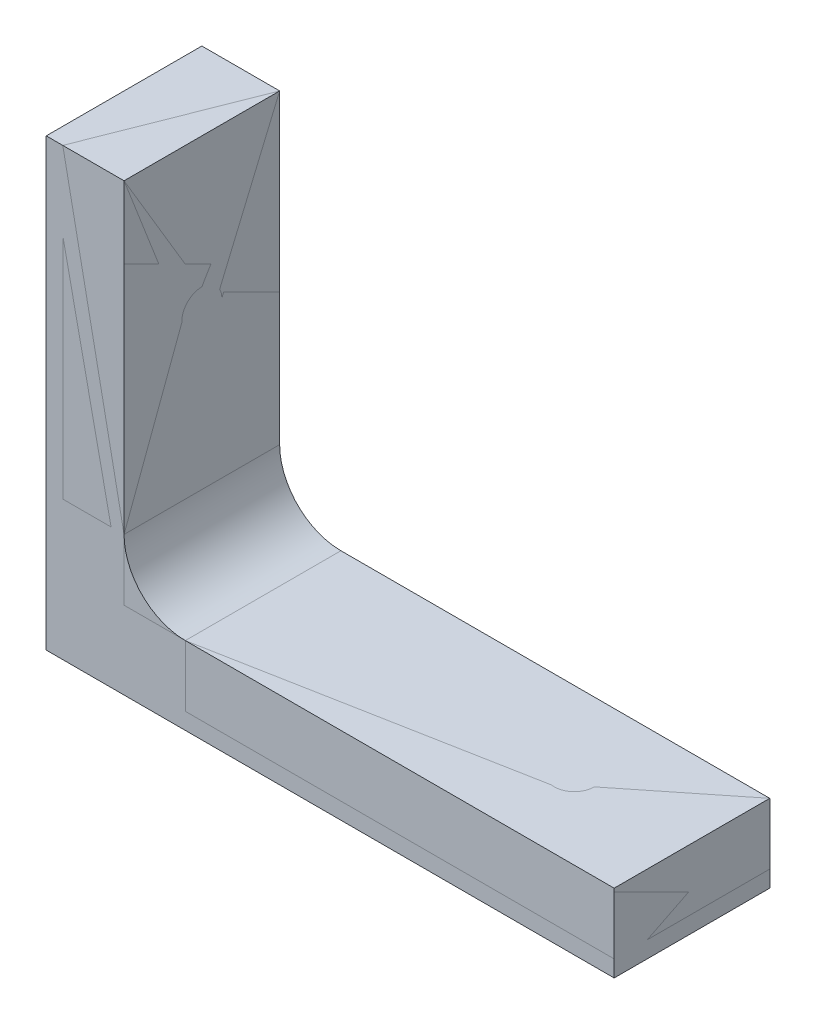
ISO-10303-21;
HEADER;
FILE_DESCRIPTION(('STEP AP214'),'2;1');
FILE_NAME('part.step','',(''),(''),'','','');
FILE_SCHEMA(('AUTOMOTIVE_DESIGN { 1 0 10303 214 1 1 1 1 }'));
ENDSEC;
DATA;
#1=APPLICATION_CONTEXT('core data for automotive mechanical design processes');
#2=APPLICATION_PROTOCOL_DEFINITION('international standard','automotive_design',2000,#1);
#3=PRODUCT_CONTEXT('',#1,'mechanical');
#4=PRODUCT('Part','Part','',(#3));
#5=PRODUCT_RELATED_PRODUCT_CATEGORY('part','',(#4));
#6=PRODUCT_DEFINITION_FORMATION('','',#4);
#7=PRODUCT_DEFINITION_CONTEXT('part definition',#1,'design');
#8=PRODUCT_DEFINITION('design','',#6,#7);
#9=PRODUCT_DEFINITION_SHAPE('','',#8);
#10=(LENGTH_UNIT() NAMED_UNIT(*) SI_UNIT(.MILLI.,.METRE.));
#11=(NAMED_UNIT(*) PLANE_ANGLE_UNIT() SI_UNIT($,.RADIAN.));
#12=(NAMED_UNIT(*) SI_UNIT($,.STERADIAN.) SOLID_ANGLE_UNIT());
#13=UNCERTAINTY_MEASURE_WITH_UNIT(LENGTH_MEASURE(1.E-05),#10,'distance_accuracy_value','');
#14=(GEOMETRIC_REPRESENTATION_CONTEXT(3) GLOBAL_UNCERTAINTY_ASSIGNED_CONTEXT((#13)) GLOBAL_UNIT_ASSIGNED_CONTEXT((#10,
#11,#12)) REPRESENTATION_CONTEXT('',''));
#15=CARTESIAN_POINT('',(0.,0.,0.));
#16=DIRECTION('',(0.,0.,1.));
#17=DIRECTION('',(1.,0.,0.));
#18=AXIS2_PLACEMENT_3D('',#15,#16,#17);
#19=CARTESIAN_POINT('',(6.35,0.,0.));
#20=DIRECTION('',(0.,0.,1.));
#21=DIRECTION('',(0.,-1.,0.));
#22=AXIS2_PLACEMENT_3D('',#19,#20,#21);
#23=PLANE('',#22);
#24=DIRECTION('',(1.,0.,0.));
#25=VECTOR('',#24,1.);
#26=CARTESIAN_POINT('',(6.35,-25.,0.));
#27=LINE('',#26,#25);
#28=CARTESIAN_POINT('',(1.35,-25.,0.));
#29=VERTEX_POINT('',#28);
#30=CARTESIAN_POINT('',(6.35,-25.,0.));
#31=VERTEX_POINT('',#30);
#32=EDGE_CURVE('E12',#29,#31,#27,.T.);
#33=ORIENTED_EDGE('',*,*,#32,.F.);
#34=DIRECTION('',(0.,1.,0.));
#35=VECTOR('',#34,1.);
#36=CARTESIAN_POINT('',(1.35,0.,0.));
#37=LINE('',#36,#35);
#38=CARTESIAN_POINT('',(1.35,0.,0.));
#39=VERTEX_POINT('',#38);
#40=EDGE_CURVE('E106',#39,#29,#37,.F.);
#41=ORIENTED_EDGE('',*,*,#40,.F.);
#42=DIRECTION('',(1.,0.,0.));
#43=VECTOR('',#42,1.);
#44=CARTESIAN_POINT('',(6.35,0.,0.));
#45=LINE('',#44,#43);
#46=CARTESIAN_POINT('',(6.35,0.,0.));
#47=VERTEX_POINT('',#46);
#48=EDGE_CURVE('E65',#39,#47,#45,.T.);
#49=ORIENTED_EDGE('',*,*,#48,.T.);
#50=DIRECTION('',(0.,-1.,0.));
#51=VECTOR('',#50,1.);
#52=CARTESIAN_POINT('',(6.35,0.,0.));
#53=LINE('',#52,#51);
#54=EDGE_CURVE('E109',#47,#31,#53,.T.);
#55=ORIENTED_EDGE('',*,*,#54,.T.);
#56=EDGE_LOOP('',(#33,#41,#49,#55));
#57=FACE_BOUND('',#56,.T.);
#58=ADVANCED_FACE('F55',(#57),#23,.F.);
#59=CARTESIAN_POINT('',(6.35,0.,12.7));
#60=DIRECTION('',(0.,-1.,0.));
#61=DIRECTION('',(0.,0.,-1.));
#62=AXIS2_PLACEMENT_3D('',#59,#60,#61);
#63=PLANE('',#62);
#64=ORIENTED_EDGE('',*,*,#48,.F.);
#65=DIRECTION('',(0.,0.,1.));
#66=VECTOR('',#65,1.);
#67=CARTESIAN_POINT('',(1.35,0.,12.7));
#68=LINE('',#67,#66);
#69=CARTESIAN_POINT('',(1.35,0.,12.7));
#70=VERTEX_POINT('',#69);
#71=EDGE_CURVE('E134',#70,#39,#68,.F.);
#72=ORIENTED_EDGE('',*,*,#71,.F.);
#73=DIRECTION('',(1.,0.,0.));
#74=VECTOR('',#73,1.);
#75=CARTESIAN_POINT('',(6.35,0.,12.7));
#76=LINE('',#75,#74);
#77=CARTESIAN_POINT('',(6.35,0.,12.7));
#78=VERTEX_POINT('',#77);
#79=EDGE_CURVE('E156',#70,#78,#76,.T.);
#80=ORIENTED_EDGE('',*,*,#79,.T.);
#81=DIRECTION('',(0.,0.,-1.));
#82=VECTOR('',#81,1.);
#83=CARTESIAN_POINT('',(6.35,0.,12.7));
#84=LINE('',#83,#82);
#85=EDGE_CURVE('E196',#78,#47,#84,.T.);
#86=ORIENTED_EDGE('',*,*,#85,.T.);
#87=EDGE_LOOP('',(#64,#72,#80,#86));
#88=FACE_BOUND('',#87,.T.);
#89=ADVANCED_FACE('F192',(#88),#63,.F.);
#90=CARTESIAN_POINT('',(6.35,0.,12.7));
#91=DIRECTION('',(0.,0.,1.));
#92=DIRECTION('',(0.,-1.,0.));
#93=AXIS2_PLACEMENT_3D('',#90,#91,#92);
#94=PLANE('',#93);
#95=ORIENTED_EDGE('',*,*,#79,.F.);
#96=DIRECTION('',(0.,1.,0.));
#97=VECTOR('',#96,1.);
#98=CARTESIAN_POINT('',(1.35,0.,12.7));
#99=LINE('',#98,#97);
#100=CARTESIAN_POINT('',(1.35,-25.,12.7));
#101=VERTEX_POINT('',#100);
#102=EDGE_CURVE('E182',#70,#101,#99,.F.);
#103=ORIENTED_EDGE('',*,*,#102,.T.);
#104=DIRECTION('',(1.,0.,0.));
#105=VECTOR('',#104,1.);
#106=CARTESIAN_POINT('',(6.35,-25.,12.7));
#107=LINE('',#106,#105);
#108=CARTESIAN_POINT('',(6.35,-25.,12.7));
#109=VERTEX_POINT('',#108);
#110=EDGE_CURVE('E153',#101,#109,#107,.T.);
#111=ORIENTED_EDGE('',*,*,#110,.T.);
#112=DIRECTION('',(0.,-1.,0.));
#113=VECTOR('',#112,1.);
#114=CARTESIAN_POINT('',(6.35,0.,12.7));
#115=LINE('',#114,#113);
#116=EDGE_CURVE('E202',#78,#109,#115,.T.);
#117=ORIENTED_EDGE('',*,*,#116,.F.);
#118=EDGE_LOOP('',(#95,#103,#111,#117));
#119=FACE_BOUND('',#118,.T.);
#120=ADVANCED_FACE('F188',(#119),#94,.T.);
#121=CARTESIAN_POINT('',(11.35,-25.,12.7));
#122=DIRECTION('',(0.,0.,-1.));
#123=DIRECTION('',(-1.,0.,0.));
#124=AXIS2_PLACEMENT_3D('',#121,#122,#123);
#125=PLANE('',#124);
#126=ORIENTED_EDGE('',*,*,#110,.F.);
#127=CARTESIAN_POINT('',(11.35,-25.,12.7));
#128=DIRECTION('',(0.,0.,-1.));
#129=DIRECTION('',(-1.,0.,0.));
#130=AXIS2_PLACEMENT_3D('',#127,#128,#129);
#131=CIRCLE('',#130,10.);
#132=CARTESIAN_POINT('',(11.35,-35.,12.7));
#133=VERTEX_POINT('',#132);
#134=EDGE_CURVE('E124',#101,#133,#131,.F.);
#135=ORIENTED_EDGE('',*,*,#134,.T.);
#136=DIRECTION('',(0.,1.,0.));
#137=VECTOR('',#136,1.);
#138=CARTESIAN_POINT('',(11.35,-30.,12.7));
#139=LINE('',#138,#137);
#140=CARTESIAN_POINT('',(11.35,-30.,12.7));
#141=VERTEX_POINT('',#140);
#142=EDGE_CURVE('E74',#133,#141,#139,.T.);
#143=ORIENTED_EDGE('',*,*,#142,.T.);
#144=CARTESIAN_POINT('',(11.35,-25.,12.7));
#145=DIRECTION('',(0.,0.,1.));
#146=DIRECTION('',(1.,0.,0.));
#147=AXIS2_PLACEMENT_3D('',#144,#145,#146);
#148=CIRCLE('',#147,5.);
#149=EDGE_CURVE('E176',#109,#141,#148,.T.);
#150=ORIENTED_EDGE('',*,*,#149,.F.);
#151=EDGE_LOOP('',(#126,#135,#143,#150));
#152=FACE_BOUND('',#151,.T.);
#153=ADVANCED_FACE('F247',(#152),#125,.F.);
#154=CARTESIAN_POINT('',(0.,-30.,12.7));
#155=DIRECTION('',(0.,0.,1.));
#156=DIRECTION('',(-1.,0.,0.));
#157=AXIS2_PLACEMENT_3D('',#154,#155,#156);
#158=PLANE('',#157);
#159=ORIENTED_EDGE('',*,*,#142,.F.);
#160=DIRECTION('',(1.,0.,0.));
#161=VECTOR('',#160,1.);
#162=CARTESIAN_POINT('',(0.,-35.,12.7));
#163=LINE('',#162,#161);
#164=CARTESIAN_POINT('',(46.35,-35.,12.7));
#165=VERTEX_POINT('',#164);
#166=EDGE_CURVE('E181',#165,#133,#163,.F.);
#167=ORIENTED_EDGE('',*,*,#166,.F.);
#168=DIRECTION('',(0.,1.,0.));
#169=VECTOR('',#168,1.);
#170=CARTESIAN_POINT('',(46.35,-30.,12.7));
#171=LINE('',#170,#169);
#172=CARTESIAN_POINT('',(46.35,-30.,12.7));
#173=VERTEX_POINT('',#172);
#174=EDGE_CURVE('E149',#165,#173,#171,.T.);
#175=ORIENTED_EDGE('',*,*,#174,.T.);
#176=DIRECTION('',(-1.,0.,0.));
#177=VECTOR('',#176,1.);
#178=CARTESIAN_POINT('',(0.,-30.,12.7));
#179=LINE('',#178,#177);
#180=EDGE_CURVE('E210',#173,#141,#179,.T.);
#181=ORIENTED_EDGE('',*,*,#180,.T.);
#182=EDGE_LOOP('',(#159,#167,#175,#181));
#183=FACE_BOUND('',#182,.T.);
#184=ADVANCED_FACE('F225',(#183),#158,.T.);
#185=CARTESIAN_POINT('',(46.35,-30.,12.7));
#186=DIRECTION('',(-1.,0.,0.));
#187=DIRECTION('',(0.,0.,-1.));
#188=AXIS2_PLACEMENT_3D('',#185,#186,#187);
#189=PLANE('',#188);
#190=ORIENTED_EDGE('',*,*,#174,.F.);
#191=DIRECTION('',(0.,0.,1.));
#192=VECTOR('',#191,1.);
#193=CARTESIAN_POINT('',(46.35,-35.,12.7));
#194=LINE('',#193,#192);
#195=CARTESIAN_POINT('',(46.35,-35.,0.));
#196=VERTEX_POINT('',#195);
#197=EDGE_CURVE('E129',#165,#196,#194,.F.);
#198=ORIENTED_EDGE('',*,*,#197,.T.);
#199=DIRECTION('',(0.,1.,0.));
#200=VECTOR('',#199,1.);
#201=CARTESIAN_POINT('',(46.35,-30.,0.));
#202=LINE('',#201,#200);
#203=CARTESIAN_POINT('',(46.35,-30.,0.));
#204=VERTEX_POINT('',#203);
#205=EDGE_CURVE('E146',#196,#204,#202,.T.);
#206=ORIENTED_EDGE('',*,*,#205,.T.);
#207=DIRECTION('',(0.,0.,-1.));
#208=VECTOR('',#207,1.);
#209=CARTESIAN_POINT('',(46.35,-30.,12.7));
#210=LINE('',#209,#208);
#211=EDGE_CURVE('E170',#173,#204,#210,.T.);
#212=ORIENTED_EDGE('',*,*,#211,.F.);
#213=EDGE_LOOP('',(#190,#198,#206,#212));
#214=FACE_BOUND('',#213,.T.);
#215=ADVANCED_FACE('F219',(#214),#189,.F.);
#216=CARTESIAN_POINT('',(0.,-30.,0.));
#217=DIRECTION('',(0.,0.,1.));
#218=DIRECTION('',(-1.,0.,0.));
#219=AXIS2_PLACEMENT_3D('',#216,#217,#218);
#220=PLANE('',#219);
#221=ORIENTED_EDGE('',*,*,#205,.F.);
#222=DIRECTION('',(1.,0.,0.));
#223=VECTOR('',#222,1.);
#224=CARTESIAN_POINT('',(0.,-35.,0.));
#225=LINE('',#224,#223);
#226=CARTESIAN_POINT('',(11.35,-35.,0.));
#227=VERTEX_POINT('',#226);
#228=EDGE_CURVE('E179',#196,#227,#225,.F.);
#229=ORIENTED_EDGE('',*,*,#228,.T.);
#230=DIRECTION('',(0.,1.,0.));
#231=VECTOR('',#230,1.);
#232=CARTESIAN_POINT('',(11.35,-30.,0.));
#233=LINE('',#232,#231);
#234=CARTESIAN_POINT('',(11.35,-30.,0.));
#235=VERTEX_POINT('',#234);
#236=EDGE_CURVE('E137',#227,#235,#233,.T.);
#237=ORIENTED_EDGE('',*,*,#236,.T.);
#238=DIRECTION('',(-1.,0.,0.));
#239=VECTOR('',#238,1.);
#240=CARTESIAN_POINT('',(0.,-30.,0.));
#241=LINE('',#240,#239);
#242=EDGE_CURVE('E208',#204,#235,#241,.T.);
#243=ORIENTED_EDGE('',*,*,#242,.F.);
#244=EDGE_LOOP('',(#221,#229,#237,#243));
#245=FACE_BOUND('',#244,.T.);
#246=ADVANCED_FACE('F230',(#245),#220,.F.);
#247=CARTESIAN_POINT('',(11.35,-25.,0.));
#248=DIRECTION('',(0.,0.,1.));
#249=DIRECTION('',(1.,0.,0.));
#250=AXIS2_PLACEMENT_3D('',#247,#248,#249);
#251=PLANE('',#250);
#252=CARTESIAN_POINT('',(11.35,-25.,0.));
#253=DIRECTION('',(0.,0.,-1.));
#254=DIRECTION('',(-1.,0.,0.));
#255=AXIS2_PLACEMENT_3D('',#252,#253,#254);
#256=CIRCLE('',#255,10.);
#257=EDGE_CURVE('E122',#227,#29,#256,.T.);
#258=ORIENTED_EDGE('',*,*,#257,.T.);
#259=ORIENTED_EDGE('',*,*,#32,.T.);
#260=CARTESIAN_POINT('',(11.35,-25.,0.));
#261=DIRECTION('',(0.,0.,-1.));
#262=DIRECTION('',(-1.,0.,0.));
#263=AXIS2_PLACEMENT_3D('',#260,#261,#262);
#264=CIRCLE('',#263,5.);
#265=EDGE_CURVE('E174',#235,#31,#264,.T.);
#266=ORIENTED_EDGE('',*,*,#265,.F.);
#267=ORIENTED_EDGE('',*,*,#236,.F.);
#268=EDGE_LOOP('',(#258,#259,#266,#267));
#269=FACE_BOUND('',#268,.T.);
#270=ADVANCED_FACE('F57',(#269),#251,.F.);
#271=CARTESIAN_POINT('',(0.,-30.,12.7));
#272=DIRECTION('',(0.,-1.,0.));
#273=DIRECTION('',(1.,0.,0.));
#274=AXIS2_PLACEMENT_3D('',#271,#272,#273);
#275=PLANE('',#274);
#276=CARTESIAN_POINT('',(36.75,-30.,6.35));
#277=DIRECTION('',(0.,-1.,0.));
#278=DIRECTION('',(1.,0.,0.));
#279=AXIS2_PLACEMENT_3D('',#276,#277,#278);
#280=CIRCLE('',#279,1.63195);
#281=CARTESIAN_POINT('',(38.38195,-30.,6.35));
#282=VERTEX_POINT('',#281);
#283=EDGE_CURVE('E360',#282,#282,#280,.T.);
#284=ORIENTED_EDGE('',*,*,#283,.T.);
#285=EDGE_LOOP('',(#284));
#286=FACE_BOUND('',#285,.T.);
#287=ORIENTED_EDGE('',*,*,#242,.T.);
#288=DIRECTION('',(0.,0.,-1.));
#289=VECTOR('',#288,1.);
#290=CARTESIAN_POINT('',(11.35,-30.,12.7));
#291=LINE('',#290,#289);
#292=EDGE_CURVE('E160',#235,#141,#291,.F.);
#293=ORIENTED_EDGE('',*,*,#292,.T.);
#294=ORIENTED_EDGE('',*,*,#180,.F.);
#295=ORIENTED_EDGE('',*,*,#211,.T.);
#296=EDGE_LOOP('',(#287,#293,#294,#295));
#297=FACE_BOUND('',#296,.T.);
#298=ADVANCED_FACE('F215',(#286,#297),#275,.F.);
#299=CARTESIAN_POINT('',(6.35,0.,12.7));
#300=DIRECTION('',(1.,0.,0.));
#301=DIRECTION('',(0.,1.,0.));
#302=AXIS2_PLACEMENT_3D('',#299,#300,#301);
#303=PLANE('',#302);
#304=CARTESIAN_POINT('',(6.35,-12.3,6.35));
#305=DIRECTION('',(1.,0.,0.));
#306=DIRECTION('',(0.,0.,-1.));
#307=AXIS2_PLACEMENT_3D('',#304,#305,#306);
#308=CIRCLE('',#307,1.63195);
#309=CARTESIAN_POINT('',(6.35,-12.3,4.71805));
#310=VERTEX_POINT('',#309);
#311=EDGE_CURVE('E143',#310,#310,#308,.T.);
#312=ORIENTED_EDGE('',*,*,#311,.F.);
#313=EDGE_LOOP('',(#312));
#314=FACE_BOUND('',#313,.T.);
#315=ORIENTED_EDGE('',*,*,#116,.T.);
#316=DIRECTION('',(0.,0.,-1.));
#317=VECTOR('',#316,1.);
#318=CARTESIAN_POINT('',(6.35,-25.,12.7));
#319=LINE('',#318,#317);
#320=EDGE_CURVE('E165',#109,#31,#319,.T.);
#321=ORIENTED_EDGE('',*,*,#320,.T.);
#322=ORIENTED_EDGE('',*,*,#54,.F.);
#323=ORIENTED_EDGE('',*,*,#85,.F.);
#324=EDGE_LOOP('',(#315,#321,#322,#323));
#325=FACE_BOUND('',#324,.T.);
#326=ADVANCED_FACE('F199',(#314,#325),#303,.T.);
#327=CARTESIAN_POINT('',(11.35,-25.,12.7));
#328=DIRECTION('',(0.,0.,-1.));
#329=DIRECTION('',(-1.,0.,0.));
#330=AXIS2_PLACEMENT_3D('',#327,#328,#329);
#331=CYLINDRICAL_SURFACE('',#330,5.);
#332=ORIENTED_EDGE('',*,*,#149,.T.);
#333=ORIENTED_EDGE('',*,*,#292,.F.);
#334=ORIENTED_EDGE('',*,*,#265,.T.);
#335=ORIENTED_EDGE('',*,*,#320,.F.);
#336=EDGE_LOOP('',(#332,#333,#334,#335));
#337=FACE_BOUND('',#336,.T.);
#338=ADVANCED_FACE('F279',(#337),#331,.F.);
#339=CARTESIAN_POINT('',(0.,-35.,12.7));
#340=DIRECTION('',(0.,-1.,0.));
#341=DIRECTION('',(1.,0.,0.));
#342=AXIS2_PLACEMENT_3D('',#339,#340,#341);
#343=PLANE('',#342);
#344=CARTESIAN_POINT('',(36.75,-35.,6.35));
#345=DIRECTION('',(0.,-1.,0.));
#346=DIRECTION('',(1.,0.,0.));
#347=AXIS2_PLACEMENT_3D('',#344,#345,#346);
#348=CIRCLE('',#347,1.63195);
#349=CARTESIAN_POINT('',(38.38195,-35.,6.35));
#350=VERTEX_POINT('',#349);
#351=EDGE_CURVE('E59',#350,#350,#348,.T.);
#352=ORIENTED_EDGE('',*,*,#351,.F.);
#353=EDGE_LOOP('',(#352));
#354=FACE_BOUND('',#353,.T.);
#355=ORIENTED_EDGE('',*,*,#228,.F.);
#356=ORIENTED_EDGE('',*,*,#197,.F.);
#357=ORIENTED_EDGE('',*,*,#166,.T.);
#358=DIRECTION('',(0.,0.,1.));
#359=VECTOR('',#358,1.);
#360=CARTESIAN_POINT('',(11.35,-35.,12.7));
#361=LINE('',#360,#359);
#362=EDGE_CURVE('E128',#227,#133,#361,.T.);
#363=ORIENTED_EDGE('',*,*,#362,.F.);
#364=EDGE_LOOP('',(#355,#356,#357,#363));
#365=FACE_BOUND('',#364,.T.);
#366=ADVANCED_FACE('F229',(#354,#365),#343,.T.);
#367=CARTESIAN_POINT('',(1.35,0.,12.7));
#368=DIRECTION('',(1.,0.,0.));
#369=DIRECTION('',(0.,1.,0.));
#370=AXIS2_PLACEMENT_3D('',#367,#368,#369);
#371=PLANE('',#370);
#372=CARTESIAN_POINT('',(1.35,-12.3,6.35));
#373=DIRECTION('',(1.,0.,0.));
#374=DIRECTION('',(0.,1.,0.));
#375=AXIS2_PLACEMENT_3D('',#372,#373,#374);
#376=CIRCLE('',#375,1.63195);
#377=CARTESIAN_POINT('',(1.35,-10.66805,6.35));
#378=VERTEX_POINT('',#377);
#379=EDGE_CURVE('E139',#378,#378,#376,.F.);
#380=ORIENTED_EDGE('',*,*,#379,.F.);
#381=EDGE_LOOP('',(#380));
#382=FACE_BOUND('',#381,.T.);
#383=ORIENTED_EDGE('',*,*,#102,.F.);
#384=ORIENTED_EDGE('',*,*,#71,.T.);
#385=ORIENTED_EDGE('',*,*,#40,.T.);
#386=DIRECTION('',(0.,0.,1.));
#387=VECTOR('',#386,1.);
#388=CARTESIAN_POINT('',(1.35,-25.,12.7));
#389=LINE('',#388,#387);
#390=EDGE_CURVE('E119',#101,#29,#389,.F.);
#391=ORIENTED_EDGE('',*,*,#390,.F.);
#392=EDGE_LOOP('',(#383,#384,#385,#391));
#393=FACE_BOUND('',#392,.T.);
#394=ADVANCED_FACE('F132',(#382,#393),#371,.F.);
#395=CARTESIAN_POINT('',(11.35,-25.,12.7));
#396=DIRECTION('',(0.,0.,-1.));
#397=DIRECTION('',(-1.,0.,0.));
#398=AXIS2_PLACEMENT_3D('',#395,#396,#397);
#399=CYLINDRICAL_SURFACE('',#398,10.);
#400=ORIENTED_EDGE('',*,*,#134,.F.);
#401=ORIENTED_EDGE('',*,*,#390,.T.);
#402=ORIENTED_EDGE('',*,*,#257,.F.);
#403=ORIENTED_EDGE('',*,*,#362,.T.);
#404=EDGE_LOOP('',(#400,#401,#402,#403));
#405=FACE_BOUND('',#404,.T.);
#406=ADVANCED_FACE('F120',(#405),#399,.T.);
#407=CARTESIAN_POINT('',(6.35,-12.3,6.35));
#408=DIRECTION('',(-1.,0.,0.));
#409=DIRECTION('',(0.,0.,1.));
#410=AXIS2_PLACEMENT_3D('',#407,#408,#409);
#411=CYLINDRICAL_SURFACE('',#410,1.63195);
#412=ORIENTED_EDGE('',*,*,#311,.T.);
#413=EDGE_LOOP('',(#412));
#414=FACE_BOUND('',#413,.T.);
#415=ORIENTED_EDGE('',*,*,#379,.T.);
#416=EDGE_LOOP('',(#415));
#417=FACE_BOUND('',#416,.T.);
#418=ADVANCED_FACE('F298',(#414,#417),#411,.F.);
#419=CARTESIAN_POINT('',(36.75,-36.35,6.35));
#420=DIRECTION('',(0.,1.,0.));
#421=DIRECTION('',(0.,0.,1.));
#422=AXIS2_PLACEMENT_3D('',#419,#420,#421);
#423=CYLINDRICAL_SURFACE('',#422,1.63195);
#424=ORIENTED_EDGE('',*,*,#351,.T.);
#425=EDGE_LOOP('',(#424));
#426=FACE_BOUND('',#425,.T.);
#427=ORIENTED_EDGE('',*,*,#283,.F.);
#428=EDGE_LOOP('',(#427));
#429=FACE_BOUND('',#428,.T.);
#430=ADVANCED_FACE('F325',(#426,#429),#423,.F.);
#431=CLOSED_SHELL('',(#58,#89,#120,#153,#184,#215,#246,#270,#298,#326,#338,#366,#394,#406,#418,#430));
#432=MANIFOLD_SOLID_BREP('B2',#431);
#433=CARTESIAN_POINT('',(46.35,0.,12.7));
#434=DIRECTION('',(-1.,0.,0.));
#435=DIRECTION('',(0.,-1.,0.));
#436=AXIS2_PLACEMENT_3D('',#433,#434,#435);
#437=PLANE('',#436);
#438=DIRECTION('',(0.,1.,0.));
#439=VECTOR('',#438,1.);
#440=CARTESIAN_POINT('',(46.35,0.,0.));
#441=LINE('',#440,#439);
#442=CARTESIAN_POINT('',(46.35,-36.35,0.));
#443=VERTEX_POINT('',#442);
#444=CARTESIAN_POINT('',(46.35,-30.,0.));
#445=VERTEX_POINT('',#444);
#446=EDGE_CURVE('E513',#443,#445,#441,.T.);
#447=ORIENTED_EDGE('',*,*,#446,.T.);
#448=DIRECTION('',(0.,0.,-1.));
#449=VECTOR('',#448,1.);
#450=CARTESIAN_POINT('',(46.35,-30.,12.7));
#451=LINE('',#450,#449);
#452=CARTESIAN_POINT('',(46.35,-30.,12.7));
#453=VERTEX_POINT('',#452);
#454=EDGE_CURVE('E53',#453,#445,#451,.T.);
#455=ORIENTED_EDGE('',*,*,#454,.F.);
#456=DIRECTION('',(0.,1.,0.));
#457=VECTOR('',#456,1.);
#458=CARTESIAN_POINT('',(46.35,0.,12.7));
#459=LINE('',#458,#457);
#460=CARTESIAN_POINT('',(46.35,-36.35,12.7));
#461=VERTEX_POINT('',#460);
#462=EDGE_CURVE('E527',#461,#453,#459,.T.);
#463=ORIENTED_EDGE('',*,*,#462,.F.);
#464=DIRECTION('',(0.,0.,-1.));
#465=VECTOR('',#464,1.);
#466=CARTESIAN_POINT('',(46.35,-36.35,12.7));
#467=LINE('',#466,#465);
#468=EDGE_CURVE('E512',#461,#443,#467,.T.);
#469=ORIENTED_EDGE('',*,*,#468,.T.);
#470=EDGE_LOOP('',(#447,#455,#463,#469));
#471=FACE_BOUND('',#470,.T.);
#472=ADVANCED_FACE('F427',(#471),#437,.F.);
#473=CARTESIAN_POINT('',(0.,-30.,12.7));
#474=DIRECTION('',(0.,-1.,0.));
#475=DIRECTION('',(1.,0.,0.));
#476=AXIS2_PLACEMENT_3D('',#473,#474,#475);
#477=PLANE('',#476);
#478=DIRECTION('',(-1.,0.,0.));
#479=VECTOR('',#478,1.);
#480=CARTESIAN_POINT('',(0.,-30.,0.));
#481=LINE('',#480,#479);
#482=CARTESIAN_POINT('',(6.35,-30.,0.));
#483=VERTEX_POINT('',#482);
#484=EDGE_CURVE('E516',#445,#483,#481,.T.);
#485=ORIENTED_EDGE('',*,*,#484,.T.);
#486=DIRECTION('',(0.,0.,-1.));
#487=VECTOR('',#486,1.);
#488=CARTESIAN_POINT('',(6.35,-30.,12.7));
#489=LINE('',#488,#487);
#490=CARTESIAN_POINT('',(6.35,-30.,12.7));
#491=VERTEX_POINT('',#490);
#492=EDGE_CURVE('E436',#491,#483,#489,.T.);
#493=ORIENTED_EDGE('',*,*,#492,.F.);
#494=DIRECTION('',(-1.,0.,0.));
#495=VECTOR('',#494,1.);
#496=CARTESIAN_POINT('',(0.,-30.,12.7));
#497=LINE('',#496,#495);
#498=EDGE_CURVE('E480',#453,#491,#497,.T.);
#499=ORIENTED_EDGE('',*,*,#498,.F.);
#500=ORIENTED_EDGE('',*,*,#454,.T.);
#501=EDGE_LOOP('',(#485,#493,#499,#500));
#502=FACE_BOUND('',#501,.T.);
#503=ADVANCED_FACE('F534',(#502),#477,.F.);
#504=CARTESIAN_POINT('',(6.35,0.,12.7));
#505=DIRECTION('',(1.,0.,0.));
#506=DIRECTION('',(0.,1.,0.));
#507=AXIS2_PLACEMENT_3D('',#504,#505,#506);
#508=PLANE('',#507);
#509=DIRECTION('',(0.,-1.,0.));
#510=VECTOR('',#509,1.);
#511=CARTESIAN_POINT('',(6.35,0.,0.));
#512=LINE('',#511,#510);
#513=CARTESIAN_POINT('',(6.35,0.,0.));
#514=VERTEX_POINT('',#513);
#515=EDGE_CURVE('E520',#514,#483,#512,.T.);
#516=ORIENTED_EDGE('',*,*,#515,.F.);
#517=DIRECTION('',(0.,0.,-1.));
#518=VECTOR('',#517,1.);
#519=CARTESIAN_POINT('',(6.35,0.,12.7));
#520=LINE('',#519,#518);
#521=CARTESIAN_POINT('',(6.35,0.,12.7));
#522=VERTEX_POINT('',#521);
#523=EDGE_CURVE('E496',#522,#514,#520,.T.);
#524=ORIENTED_EDGE('',*,*,#523,.F.);
#525=DIRECTION('',(0.,-1.,0.));
#526=VECTOR('',#525,1.);
#527=CARTESIAN_POINT('',(6.35,0.,12.7));
#528=LINE('',#527,#526);
#529=EDGE_CURVE('E505',#522,#491,#528,.T.);
#530=ORIENTED_EDGE('',*,*,#529,.T.);
#531=ORIENTED_EDGE('',*,*,#492,.T.);
#532=EDGE_LOOP('',(#516,#524,#530,#531));
#533=FACE_BOUND('',#532,.T.);
#534=ADVANCED_FACE('F533',(#533),#508,.T.);
#535=CARTESIAN_POINT('',(0.,0.,12.7));
#536=DIRECTION('',(0.,1.,0.));
#537=DIRECTION('',(0.,0.,1.));
#538=AXIS2_PLACEMENT_3D('',#535,#536,#537);
#539=PLANE('',#538);
#540=DIRECTION('',(1.,0.,0.));
#541=VECTOR('',#540,1.);
#542=CARTESIAN_POINT('',(0.,0.,0.));
#543=LINE('',#542,#541);
#544=CARTESIAN_POINT('',(0.,0.,0.));
#545=VERTEX_POINT('',#544);
#546=EDGE_CURVE('E495',#545,#514,#543,.T.);
#547=ORIENTED_EDGE('',*,*,#546,.F.);
#548=DIRECTION('',(0.,0.,-1.));
#549=VECTOR('',#548,1.);
#550=CARTESIAN_POINT('',(0.,0.,12.7));
#551=LINE('',#550,#549);
#552=CARTESIAN_POINT('',(0.,0.,12.7));
#553=VERTEX_POINT('',#552);
#554=EDGE_CURVE('E489',#553,#545,#551,.T.);
#555=ORIENTED_EDGE('',*,*,#554,.F.);
#556=DIRECTION('',(1.,0.,0.));
#557=VECTOR('',#556,1.);
#558=CARTESIAN_POINT('',(0.,0.,12.7));
#559=LINE('',#558,#557);
#560=EDGE_CURVE('E493',#553,#522,#559,.T.);
#561=ORIENTED_EDGE('',*,*,#560,.T.);
#562=ORIENTED_EDGE('',*,*,#523,.T.);
#563=EDGE_LOOP('',(#547,#555,#561,#562));
#564=FACE_BOUND('',#563,.T.);
#565=ADVANCED_FACE('F491',(#564),#539,.T.);
#566=CARTESIAN_POINT('',(0.,0.,12.7));
#567=DIRECTION('',(1.,0.,0.));
#568=DIRECTION('',(0.,1.,0.));
#569=AXIS2_PLACEMENT_3D('',#566,#567,#568);
#570=PLANE('',#569);
#571=DIRECTION('',(0.,-1.,0.));
#572=VECTOR('',#571,1.);
#573=CARTESIAN_POINT('',(0.,0.,0.));
#574=LINE('',#573,#572);
#575=CARTESIAN_POINT('',(0.,-36.35,0.));
#576=VERTEX_POINT('',#575);
#577=EDGE_CURVE('E466',#545,#576,#574,.T.);
#578=ORIENTED_EDGE('',*,*,#577,.T.);
#579=DIRECTION('',(0.,0.,-1.));
#580=VECTOR('',#579,1.);
#581=CARTESIAN_POINT('',(0.,-36.35,12.7));
#582=LINE('',#581,#580);
#583=CARTESIAN_POINT('',(0.,-36.35,12.7));
#584=VERTEX_POINT('',#583);
#585=EDGE_CURVE('E497',#584,#576,#582,.T.);
#586=ORIENTED_EDGE('',*,*,#585,.F.);
#587=DIRECTION('',(0.,-1.,0.));
#588=VECTOR('',#587,1.);
#589=CARTESIAN_POINT('',(0.,0.,12.7));
#590=LINE('',#589,#588);
#591=EDGE_CURVE('E499',#553,#584,#590,.T.);
#592=ORIENTED_EDGE('',*,*,#591,.F.);
#593=ORIENTED_EDGE('',*,*,#554,.T.);
#594=EDGE_LOOP('',(#578,#586,#592,#593));
#595=FACE_BOUND('',#594,.T.);
#596=ADVANCED_FACE('F500',(#595),#570,.F.);
#597=CARTESIAN_POINT('',(0.,-36.35,12.7));
#598=DIRECTION('',(0.,1.,0.));
#599=DIRECTION('',(0.,0.,1.));
#600=AXIS2_PLACEMENT_3D('',#597,#598,#599);
#601=PLANE('',#600);
#602=DIRECTION('',(1.,0.,0.));
#603=VECTOR('',#602,1.);
#604=CARTESIAN_POINT('',(0.,-36.35,0.));
#605=LINE('',#604,#603);
#606=EDGE_CURVE('E472',#576,#443,#605,.T.);
#607=ORIENTED_EDGE('',*,*,#606,.T.);
#608=ORIENTED_EDGE('',*,*,#468,.F.);
#609=DIRECTION('',(1.,0.,0.));
#610=VECTOR('',#609,1.);
#611=CARTESIAN_POINT('',(0.,-36.35,12.7));
#612=LINE('',#611,#610);
#613=EDGE_CURVE('E444',#584,#461,#612,.T.);
#614=ORIENTED_EDGE('',*,*,#613,.F.);
#615=ORIENTED_EDGE('',*,*,#585,.T.);
#616=EDGE_LOOP('',(#607,#608,#614,#615));
#617=FACE_BOUND('',#616,.T.);
#618=ADVANCED_FACE('F541',(#617),#601,.F.);
#619=CARTESIAN_POINT('',(0.,0.,12.7));
#620=DIRECTION('',(0.,0.,1.));
#621=DIRECTION('',(1.,0.,0.));
#622=AXIS2_PLACEMENT_3D('',#619,#620,#621);
#623=PLANE('',#622);
#624=ORIENTED_EDGE('',*,*,#462,.T.);
#625=ORIENTED_EDGE('',*,*,#498,.T.);
#626=ORIENTED_EDGE('',*,*,#529,.F.);
#627=ORIENTED_EDGE('',*,*,#560,.F.);
#628=ORIENTED_EDGE('',*,*,#591,.T.);
#629=ORIENTED_EDGE('',*,*,#613,.T.);
#630=EDGE_LOOP('',(#624,#625,#626,#627,#628,#629));
#631=FACE_BOUND('',#630,.T.);
#632=ADVANCED_FACE('F503',(#631),#623,.T.);
#633=CARTESIAN_POINT('',(0.,0.,0.));
#634=DIRECTION('',(0.,0.,1.));
#635=DIRECTION('',(1.,0.,0.));
#636=AXIS2_PLACEMENT_3D('',#633,#634,#635);
#637=PLANE('',#636);
#638=ORIENTED_EDGE('',*,*,#446,.F.);
#639=ORIENTED_EDGE('',*,*,#606,.F.);
#640=ORIENTED_EDGE('',*,*,#577,.F.);
#641=ORIENTED_EDGE('',*,*,#546,.T.);
#642=ORIENTED_EDGE('',*,*,#515,.T.);
#643=ORIENTED_EDGE('',*,*,#484,.F.);
#644=EDGE_LOOP('',(#638,#639,#640,#641,#642,#643));
#645=FACE_BOUND('',#644,.T.);
#646=ADVANCED_FACE('F538',(#645),#637,.F.);
#647=CLOSED_SHELL('',(#472,#503,#534,#565,#596,#618,#632,#646));
#648=MANIFOLD_SOLID_BREP('B6_NOT_SHOWN',#647);
#649=ADVANCED_BREP_SHAPE_REPRESENTATION('',(#18,#432,#648),#14);
#650=SHAPE_DEFINITION_REPRESENTATION(#9,#649);
ENDSEC;
END-ISO-10303-21;
